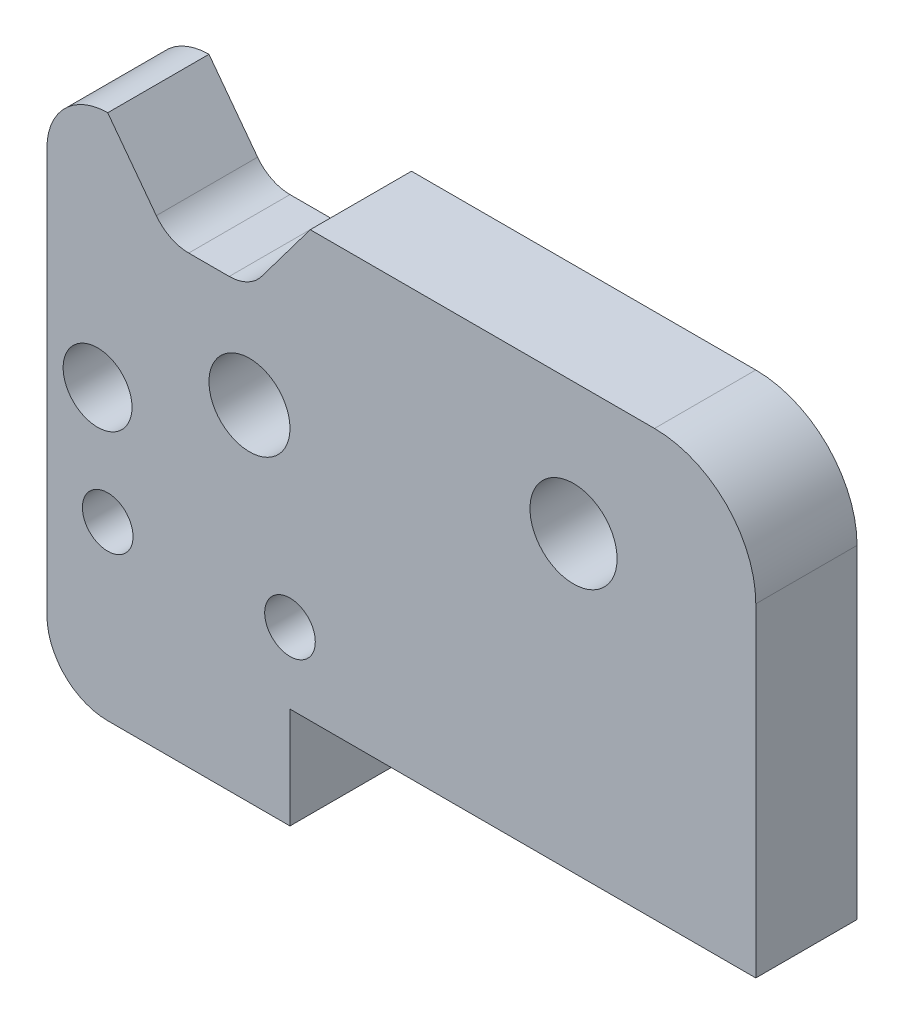
ISO-10303-21;
HEADER;
FILE_DESCRIPTION(('STEP AP214'),'2;1');
FILE_NAME('part.step','',(''),(''),'','','');
FILE_SCHEMA(('AUTOMOTIVE_DESIGN { 1 0 10303 214 1 1 1 1 }'));
ENDSEC;
DATA;
#1=APPLICATION_CONTEXT('core data for automotive mechanical design processes');
#2=APPLICATION_PROTOCOL_DEFINITION('international standard','automotive_design',2000,#1);
#3=PRODUCT_CONTEXT('',#1,'mechanical');
#4=PRODUCT('Part','Part','',(#3));
#5=PRODUCT_RELATED_PRODUCT_CATEGORY('part','',(#4));
#6=PRODUCT_DEFINITION_FORMATION('','',#4);
#7=PRODUCT_DEFINITION_CONTEXT('part definition',#1,'design');
#8=PRODUCT_DEFINITION('design','',#6,#7);
#9=PRODUCT_DEFINITION_SHAPE('','',#8);
#10=(LENGTH_UNIT() NAMED_UNIT(*) SI_UNIT(.MILLI.,.METRE.));
#11=(NAMED_UNIT(*) PLANE_ANGLE_UNIT() SI_UNIT($,.RADIAN.));
#12=(NAMED_UNIT(*) SI_UNIT($,.STERADIAN.) SOLID_ANGLE_UNIT());
#13=UNCERTAINTY_MEASURE_WITH_UNIT(LENGTH_MEASURE(1.E-05),#10,'distance_accuracy_value','');
#14=(GEOMETRIC_REPRESENTATION_CONTEXT(3) GLOBAL_UNCERTAINTY_ASSIGNED_CONTEXT((#13)) GLOBAL_UNIT_ASSIGNED_CONTEXT((#10,
#11,#12)) REPRESENTATION_CONTEXT('',''));
#15=CARTESIAN_POINT('',(0.,0.,0.));
#16=DIRECTION('',(0.,0.,1.));
#17=DIRECTION('',(1.,0.,0.));
#18=AXIS2_PLACEMENT_3D('',#15,#16,#17);
#19=CARTESIAN_POINT('',(15.,6.5,5.));
#20=DIRECTION('',(0.,-1.,0.));
#21=DIRECTION('',(1.,0.,0.));
#22=AXIS2_PLACEMENT_3D('',#19,#20,#21);
#23=PLANE('',#22);
#24=DIRECTION('',(-1.,0.,0.));
#25=VECTOR('',#24,1.);
#26=CARTESIAN_POINT('',(15.,6.5,0.));
#27=LINE('',#26,#25);
#28=CARTESIAN_POINT('',(10.,6.5,0.));
#29=VERTEX_POINT('',#28);
#30=CARTESIAN_POINT('',(-7.,6.5,0.));
#31=VERTEX_POINT('',#30);
#32=EDGE_CURVE('E161',#29,#31,#27,.T.);
#33=ORIENTED_EDGE('',*,*,#32,.T.);
#34=DIRECTION('',(0.,0.,1.));
#35=VECTOR('',#34,1.);
#36=CARTESIAN_POINT('',(-7.,6.5,-10.770329614269));
#37=LINE('',#36,#35);
#38=CARTESIAN_POINT('',(-7.,6.5,5.));
#39=VERTEX_POINT('',#38);
#40=EDGE_CURVE('E146',#31,#39,#37,.T.);
#41=ORIENTED_EDGE('',*,*,#40,.T.);
#42=DIRECTION('',(-1.,0.,0.));
#43=VECTOR('',#42,1.);
#44=CARTESIAN_POINT('',(15.,6.5,5.));
#45=LINE('',#44,#43);
#46=CARTESIAN_POINT('',(10.,6.5,5.));
#47=VERTEX_POINT('',#46);
#48=EDGE_CURVE('E158',#47,#39,#45,.T.);
#49=ORIENTED_EDGE('',*,*,#48,.F.);
#50=DIRECTION('',(0.,0.,-1.));
#51=VECTOR('',#50,1.);
#52=CARTESIAN_POINT('',(10.,6.5,5.));
#53=LINE('',#52,#51);
#54=EDGE_CURVE('E190',#47,#29,#53,.T.);
#55=ORIENTED_EDGE('',*,*,#54,.T.);
#56=EDGE_LOOP('',(#33,#41,#49,#55));
#57=FACE_BOUND('',#56,.T.);
#58=ADVANCED_FACE('F36',(#57),#23,.F.);
#59=CARTESIAN_POINT('',(-8.,-14.5,5.));
#60=DIRECTION('',(0.,1.,0.));
#61=DIRECTION('',(0.,0.,1.));
#62=AXIS2_PLACEMENT_3D('',#59,#60,#61);
#63=PLANE('',#62);
#64=CARTESIAN_POINT('',(12.,-14.5,2.5));
#65=DIRECTION('',(0.,-1.,0.));
#66=DIRECTION('',(0.,0.,-1.));
#67=AXIS2_PLACEMENT_3D('',#64,#65,#66);
#68=CIRCLE('',#67,1.25);
#69=CARTESIAN_POINT('',(12.,-14.5,1.25));
#70=VERTEX_POINT('',#69);
#71=EDGE_CURVE('E292',#70,#70,#68,.T.);
#72=ORIENTED_EDGE('',*,*,#71,.F.);
#73=EDGE_LOOP('',(#72));
#74=FACE_BOUND('',#73,.T.);
#75=CARTESIAN_POINT('',(-1.4,-14.5,2.5));
#76=DIRECTION('',(0.,-1.,0.));
#77=DIRECTION('',(0.,0.,-1.));
#78=AXIS2_PLACEMENT_3D('',#75,#76,#77);
#79=CIRCLE('',#78,1.25);
#80=CARTESIAN_POINT('',(-1.4,-14.5,1.25));
#81=VERTEX_POINT('',#80);
#82=EDGE_CURVE('E299',#81,#81,#79,.T.);
#83=ORIENTED_EDGE('',*,*,#82,.F.);
#84=EDGE_LOOP('',(#83));
#85=FACE_BOUND('',#84,.T.);
#86=DIRECTION('',(1.,0.,0.));
#87=VECTOR('',#86,1.);
#88=CARTESIAN_POINT('',(-8.,-14.5,0.));
#89=LINE('',#88,#87);
#90=CARTESIAN_POINT('',(-8.,-14.5,0.));
#91=VERTEX_POINT('',#90);
#92=CARTESIAN_POINT('',(15.,-14.5,0.));
#93=VERTEX_POINT('',#92);
#94=EDGE_CURVE('E175',#91,#93,#89,.T.);
#95=ORIENTED_EDGE('',*,*,#94,.T.);
#96=DIRECTION('',(0.,0.,-1.));
#97=VECTOR('',#96,1.);
#98=CARTESIAN_POINT('',(15.,-14.5,5.));
#99=LINE('',#98,#97);
#100=CARTESIAN_POINT('',(15.,-14.5,5.));
#101=VERTEX_POINT('',#100);
#102=EDGE_CURVE('E182',#101,#93,#99,.T.);
#103=ORIENTED_EDGE('',*,*,#102,.F.);
#104=DIRECTION('',(1.,0.,0.));
#105=VECTOR('',#104,1.);
#106=CARTESIAN_POINT('',(-8.,-14.5,5.));
#107=LINE('',#106,#105);
#108=CARTESIAN_POINT('',(-8.,-14.5,5.));
#109=VERTEX_POINT('',#108);
#110=EDGE_CURVE('E169',#109,#101,#107,.T.);
#111=ORIENTED_EDGE('',*,*,#110,.F.);
#112=DIRECTION('',(0.,0.,-1.));
#113=VECTOR('',#112,1.);
#114=CARTESIAN_POINT('',(-8.,-14.5,5.));
#115=LINE('',#114,#113);
#116=EDGE_CURVE('E187',#109,#91,#115,.T.);
#117=ORIENTED_EDGE('',*,*,#116,.T.);
#118=EDGE_LOOP('',(#95,#103,#111,#117));
#119=FACE_BOUND('',#118,.T.);
#120=ADVANCED_FACE('F319',(#74,#85,#119),#63,.F.);
#121=CARTESIAN_POINT('',(15.,-14.5,5.));
#122=DIRECTION('',(-1.,0.,0.));
#123=DIRECTION('',(0.,0.,1.));
#124=AXIS2_PLACEMENT_3D('',#121,#122,#123);
#125=PLANE('',#124);
#126=DIRECTION('',(0.,1.,0.));
#127=VECTOR('',#126,1.);
#128=CARTESIAN_POINT('',(15.,-14.5,0.));
#129=LINE('',#128,#127);
#130=CARTESIAN_POINT('',(15.,1.49999999999999,0.));
#131=VERTEX_POINT('',#130);
#132=EDGE_CURVE('E170',#93,#131,#129,.T.);
#133=ORIENTED_EDGE('',*,*,#132,.T.);
#134=DIRECTION('',(0.,0.,-1.));
#135=VECTOR('',#134,1.);
#136=CARTESIAN_POINT('',(15.,1.5,5.));
#137=LINE('',#136,#135);
#138=CARTESIAN_POINT('',(15.,1.49999999999999,5.));
#139=VERTEX_POINT('',#138);
#140=EDGE_CURVE('E579',#131,#139,#137,.F.);
#141=ORIENTED_EDGE('',*,*,#140,.T.);
#142=DIRECTION('',(0.,1.,0.));
#143=VECTOR('',#142,1.);
#144=CARTESIAN_POINT('',(15.,-14.5,5.));
#145=LINE('',#144,#143);
#146=EDGE_CURVE('E172',#101,#139,#145,.T.);
#147=ORIENTED_EDGE('',*,*,#146,.F.);
#148=ORIENTED_EDGE('',*,*,#102,.T.);
#149=EDGE_LOOP('',(#133,#141,#147,#148));
#150=FACE_BOUND('',#149,.T.);
#151=ADVANCED_FACE('F310',(#150),#125,.F.);
#152=CARTESIAN_POINT('',(-8.,6.5,5.));
#153=DIRECTION('',(0.,0.,1.));
#154=DIRECTION('',(1.,0.,0.));
#155=AXIS2_PLACEMENT_3D('',#152,#153,#154);
#156=PLANE('',#155);
#157=CARTESIAN_POINT('',(-8.00000000000001,-11.,5.));
#158=DIRECTION('',(0.,0.,1.));
#159=DIRECTION('',(1.,0.,0.));
#160=AXIS2_PLACEMENT_3D('',#157,#158,#159);
#161=CIRCLE('',#160,1.25);
#162=CARTESIAN_POINT('',(-6.75000000000001,-11.,5.));
#163=VERTEX_POINT('',#162);
#164=EDGE_CURVE('E545',#163,#163,#161,.T.);
#165=ORIENTED_EDGE('',*,*,#164,.F.);
#166=EDGE_LOOP('',(#165));
#167=FACE_BOUND('',#166,.T.);
#168=CARTESIAN_POINT('',(-17.,-11.,5.));
#169=DIRECTION('',(0.,0.,1.));
#170=DIRECTION('',(1.,0.,0.));
#171=AXIS2_PLACEMENT_3D('',#168,#169,#170);
#172=CIRCLE('',#171,1.25);
#173=CARTESIAN_POINT('',(-15.75,-11.,5.));
#174=VERTEX_POINT('',#173);
#175=EDGE_CURVE('E247',#174,#174,#172,.T.);
#176=ORIENTED_EDGE('',*,*,#175,.F.);
#177=EDGE_LOOP('',(#176));
#178=FACE_BOUND('',#177,.T.);
#179=DIRECTION('',(0.6,-0.8,0.));
#180=VECTOR('',#179,1.);
#181=CARTESIAN_POINT('',(-14.,2.5,5.));
#182=LINE('',#181,#180);
#183=CARTESIAN_POINT('',(-17.,6.5,5.));
#184=VERTEX_POINT('',#183);
#185=CARTESIAN_POINT('',(-14.6,3.3,5.));
#186=VERTEX_POINT('',#185);
#187=EDGE_CURVE('E151',#184,#186,#182,.T.);
#188=ORIENTED_EDGE('',*,*,#187,.F.);
#189=CARTESIAN_POINT('',(-17.,3.5,5.));
#190=DIRECTION('',(0.,0.,1.));
#191=DIRECTION('',(1.,0.,0.));
#192=AXIS2_PLACEMENT_3D('',#189,#190,#191);
#193=CIRCLE('',#192,3.);
#194=CARTESIAN_POINT('',(-20.,3.5,5.));
#195=VERTEX_POINT('',#194);
#196=EDGE_CURVE('E216',#184,#195,#193,.T.);
#197=ORIENTED_EDGE('',*,*,#196,.T.);
#198=DIRECTION('',(0.,1.,0.));
#199=VECTOR('',#198,1.);
#200=CARTESIAN_POINT('',(-20.,6.5,5.));
#201=LINE('',#200,#199);
#202=CARTESIAN_POINT('',(-20.,-16.5,5.));
#203=VERTEX_POINT('',#202);
#204=EDGE_CURVE('E560',#203,#195,#201,.T.);
#205=ORIENTED_EDGE('',*,*,#204,.F.);
#206=CARTESIAN_POINT('',(-17.,-16.5,5.));
#207=DIRECTION('',(0.,0.,1.));
#208=DIRECTION('',(1.,0.,0.));
#209=AXIS2_PLACEMENT_3D('',#206,#207,#208);
#210=CIRCLE('',#209,3.);
#211=CARTESIAN_POINT('',(-17.,-19.5,5.));
#212=VERTEX_POINT('',#211);
#213=EDGE_CURVE('E214',#203,#212,#210,.T.);
#214=ORIENTED_EDGE('',*,*,#213,.T.);
#215=DIRECTION('',(-1.,0.,0.));
#216=VECTOR('',#215,1.);
#217=CARTESIAN_POINT('',(-8.,-19.5,5.));
#218=LINE('',#217,#216);
#219=CARTESIAN_POINT('',(-8.,-19.5,5.));
#220=VERTEX_POINT('',#219);
#221=EDGE_CURVE('E277',#220,#212,#218,.T.);
#222=ORIENTED_EDGE('',*,*,#221,.F.);
#223=DIRECTION('',(0.,-1.,0.));
#224=VECTOR('',#223,1.);
#225=CARTESIAN_POINT('',(-8.,6.5,5.));
#226=LINE('',#225,#224);
#227=EDGE_CURVE('E287',#109,#220,#226,.T.);
#228=ORIENTED_EDGE('',*,*,#227,.F.);
#229=ORIENTED_EDGE('',*,*,#110,.T.);
#230=ORIENTED_EDGE('',*,*,#146,.T.);
#231=CARTESIAN_POINT('',(10.,1.5,5.));
#232=DIRECTION('',(0.,0.,1.));
#233=DIRECTION('',(1.,0.,0.));
#234=AXIS2_PLACEMENT_3D('',#231,#232,#233);
#235=CIRCLE('',#234,5.);
#236=EDGE_CURVE('E168',#139,#47,#235,.T.);
#237=ORIENTED_EDGE('',*,*,#236,.T.);
#238=ORIENTED_EDGE('',*,*,#48,.T.);
#239=DIRECTION('',(0.600000000000001,0.799999999999999,0.));
#240=VECTOR('',#239,1.);
#241=CARTESIAN_POINT('',(-10.,2.5,5.));
#242=LINE('',#241,#240);
#243=CARTESIAN_POINT('',(-9.40000000000001,3.3,5.));
#244=VERTEX_POINT('',#243);
#245=EDGE_CURVE('E142',#244,#39,#242,.T.);
#246=ORIENTED_EDGE('',*,*,#245,.F.);
#247=CARTESIAN_POINT('',(-11.,4.5,5.));
#248=DIRECTION('',(0.,0.,1.));
#249=DIRECTION('',(1.,0.,0.));
#250=AXIS2_PLACEMENT_3D('',#247,#248,#249);
#251=CIRCLE('',#250,2.);
#252=CARTESIAN_POINT('',(-11.,2.5,5.));
#253=VERTEX_POINT('',#252);
#254=EDGE_CURVE('E228',#244,#253,#251,.F.);
#255=ORIENTED_EDGE('',*,*,#254,.T.);
#256=DIRECTION('',(1.,0.,0.));
#257=VECTOR('',#256,1.);
#258=CARTESIAN_POINT('',(-14.,2.5,5.));
#259=LINE('',#258,#257);
#260=CARTESIAN_POINT('',(-13.,2.5,5.));
#261=VERTEX_POINT('',#260);
#262=EDGE_CURVE('E152',#261,#253,#259,.T.);
#263=ORIENTED_EDGE('',*,*,#262,.F.);
#264=CARTESIAN_POINT('',(-13.,4.5,5.));
#265=DIRECTION('',(0.,0.,1.));
#266=DIRECTION('',(1.,0.,0.));
#267=AXIS2_PLACEMENT_3D('',#264,#265,#266);
#268=CIRCLE('',#267,2.);
#269=EDGE_CURVE('E44',#261,#186,#268,.F.);
#270=ORIENTED_EDGE('',*,*,#269,.T.);
#271=EDGE_LOOP('',(#188,#197,#205,#214,#222,#228,#229,#230,#237,#238,#246,#255,#263,#270));
#272=FACE_BOUND('',#271,.T.);
#273=CARTESIAN_POINT('',(-10.,-2.5,5.));
#274=DIRECTION('',(0.,0.,1.));
#275=DIRECTION('',(1.,0.,0.));
#276=AXIS2_PLACEMENT_3D('',#273,#274,#275);
#277=CIRCLE('',#276,2.);
#278=CARTESIAN_POINT('',(-8.,-2.5,5.));
#279=VERTEX_POINT('',#278);
#280=EDGE_CURVE('E261',#279,#279,#277,.T.);
#281=ORIENTED_EDGE('',*,*,#280,.F.);
#282=EDGE_LOOP('',(#281));
#283=FACE_BOUND('',#282,.T.);
#284=CARTESIAN_POINT('',(-17.5,-5.5,5.));
#285=DIRECTION('',(0.,0.,1.));
#286=DIRECTION('',(1.,0.,0.));
#287=AXIS2_PLACEMENT_3D('',#284,#285,#286);
#288=CIRCLE('',#287,1.7);
#289=CARTESIAN_POINT('',(-15.8,-5.5,5.));
#290=VERTEX_POINT('',#289);
#291=EDGE_CURVE('E265',#290,#290,#288,.T.);
#292=ORIENTED_EDGE('',*,*,#291,.F.);
#293=EDGE_LOOP('',(#292));
#294=FACE_BOUND('',#293,.T.);
#295=CARTESIAN_POINT('',(6.,0.,5.));
#296=DIRECTION('',(0.,0.,1.));
#297=DIRECTION('',(1.,0.,0.));
#298=AXIS2_PLACEMENT_3D('',#295,#296,#297);
#299=CIRCLE('',#298,2.15);
#300=CARTESIAN_POINT('',(8.15,0.,5.));
#301=VERTEX_POINT('',#300);
#302=EDGE_CURVE('E179',#301,#301,#299,.T.);
#303=ORIENTED_EDGE('',*,*,#302,.F.);
#304=EDGE_LOOP('',(#303));
#305=FACE_BOUND('',#304,.T.);
#306=ADVANCED_FACE('F164',(#167,#178,#272,#283,#294,#305),#156,.T.);
#307=CARTESIAN_POINT('',(-8.,6.5,0.));
#308=DIRECTION('',(0.,0.,1.));
#309=DIRECTION('',(1.,0.,0.));
#310=AXIS2_PLACEMENT_3D('',#307,#308,#309);
#311=PLANE('',#310);
#312=CARTESIAN_POINT('',(-8.00000000000001,-11.,0.));
#313=DIRECTION('',(0.,0.,-1.));
#314=DIRECTION('',(-1.,0.,0.));
#315=AXIS2_PLACEMENT_3D('',#312,#313,#314);
#316=CIRCLE('',#315,1.25);
#317=CARTESIAN_POINT('',(-9.25000000000001,-11.,0.));
#318=VERTEX_POINT('',#317);
#319=EDGE_CURVE('E548',#318,#318,#316,.T.);
#320=ORIENTED_EDGE('',*,*,#319,.F.);
#321=EDGE_LOOP('',(#320));
#322=FACE_BOUND('',#321,.T.);
#323=CARTESIAN_POINT('',(-17.,-11.,0.));
#324=DIRECTION('',(0.,0.,-1.));
#325=DIRECTION('',(-1.,0.,0.));
#326=AXIS2_PLACEMENT_3D('',#323,#324,#325);
#327=CIRCLE('',#326,1.25);
#328=CARTESIAN_POINT('',(-18.25,-11.,0.));
#329=VERTEX_POINT('',#328);
#330=EDGE_CURVE('E250',#329,#329,#327,.T.);
#331=ORIENTED_EDGE('',*,*,#330,.F.);
#332=EDGE_LOOP('',(#331));
#333=FACE_BOUND('',#332,.T.);
#334=CARTESIAN_POINT('',(-17.5,-5.5,0.));
#335=DIRECTION('',(0.,0.,1.));
#336=DIRECTION('',(1.,0.,0.));
#337=AXIS2_PLACEMENT_3D('',#334,#335,#336);
#338=CIRCLE('',#337,1.7);
#339=CARTESIAN_POINT('',(-15.8,-5.5,0.));
#340=VERTEX_POINT('',#339);
#341=EDGE_CURVE('E270',#340,#340,#338,.F.);
#342=ORIENTED_EDGE('',*,*,#341,.F.);
#343=EDGE_LOOP('',(#342));
#344=FACE_BOUND('',#343,.T.);
#345=CARTESIAN_POINT('',(4.9,-6.5,0.));
#346=DIRECTION('',(0.,0.,-1.));
#347=DIRECTION('',(-1.,0.,0.));
#348=AXIS2_PLACEMENT_3D('',#345,#346,#347);
#349=CIRCLE('',#348,2.05);
#350=CARTESIAN_POINT('',(2.85,-6.5,0.));
#351=VERTEX_POINT('',#350);
#352=EDGE_CURVE('E293',#351,#351,#349,.T.);
#353=ORIENTED_EDGE('',*,*,#352,.F.);
#354=EDGE_LOOP('',(#353));
#355=FACE_BOUND('',#354,.T.);
#356=CARTESIAN_POINT('',(-17.,3.5,0.));
#357=DIRECTION('',(0.,0.,1.));
#358=DIRECTION('',(1.,0.,0.));
#359=AXIS2_PLACEMENT_3D('',#356,#357,#358);
#360=CIRCLE('',#359,3.);
#361=CARTESIAN_POINT('',(-20.,3.5,0.));
#362=VERTEX_POINT('',#361);
#363=CARTESIAN_POINT('',(-17.,6.5,0.));
#364=VERTEX_POINT('',#363);
#365=EDGE_CURVE('E209',#362,#364,#360,.F.);
#366=ORIENTED_EDGE('',*,*,#365,.T.);
#367=DIRECTION('',(-0.6,0.8,0.));
#368=VECTOR('',#367,1.);
#369=CARTESIAN_POINT('',(-14.,2.5,0.));
#370=LINE('',#369,#368);
#371=CARTESIAN_POINT('',(-14.6,3.3,0.));
#372=VERTEX_POINT('',#371);
#373=EDGE_CURVE('E162',#372,#364,#370,.T.);
#374=ORIENTED_EDGE('',*,*,#373,.F.);
#375=CARTESIAN_POINT('',(-13.,4.5,0.));
#376=DIRECTION('',(0.,0.,1.));
#377=DIRECTION('',(1.,0.,0.));
#378=AXIS2_PLACEMENT_3D('',#375,#376,#377);
#379=CIRCLE('',#378,2.);
#380=CARTESIAN_POINT('',(-13.,2.5,0.));
#381=VERTEX_POINT('',#380);
#382=EDGE_CURVE('E11',#372,#381,#379,.T.);
#383=ORIENTED_EDGE('',*,*,#382,.T.);
#384=DIRECTION('',(-1.,0.,0.));
#385=VECTOR('',#384,1.);
#386=CARTESIAN_POINT('',(-14.,2.5,0.));
#387=LINE('',#386,#385);
#388=CARTESIAN_POINT('',(-11.,2.5,0.));
#389=VERTEX_POINT('',#388);
#390=EDGE_CURVE('E237',#389,#381,#387,.T.);
#391=ORIENTED_EDGE('',*,*,#390,.F.);
#392=CARTESIAN_POINT('',(-11.,4.5,0.));
#393=DIRECTION('',(0.,0.,1.));
#394=DIRECTION('',(1.,0.,0.));
#395=AXIS2_PLACEMENT_3D('',#392,#393,#394);
#396=CIRCLE('',#395,2.);
#397=CARTESIAN_POINT('',(-9.40000000000001,3.3,0.));
#398=VERTEX_POINT('',#397);
#399=EDGE_CURVE('E230',#389,#398,#396,.T.);
#400=ORIENTED_EDGE('',*,*,#399,.T.);
#401=DIRECTION('',(-0.600000000000001,-0.799999999999999,0.));
#402=VECTOR('',#401,1.);
#403=CARTESIAN_POINT('',(-10.,2.5,0.));
#404=LINE('',#403,#402);
#405=EDGE_CURVE('E235',#31,#398,#404,.T.);
#406=ORIENTED_EDGE('',*,*,#405,.F.);
#407=ORIENTED_EDGE('',*,*,#32,.F.);
#408=CARTESIAN_POINT('',(10.,1.5,0.));
#409=DIRECTION('',(0.,0.,1.));
#410=DIRECTION('',(1.,0.,0.));
#411=AXIS2_PLACEMENT_3D('',#408,#409,#410);
#412=CIRCLE('',#411,5.);
#413=EDGE_CURVE('E580',#29,#131,#412,.F.);
#414=ORIENTED_EDGE('',*,*,#413,.T.);
#415=ORIENTED_EDGE('',*,*,#132,.F.);
#416=ORIENTED_EDGE('',*,*,#94,.F.);
#417=DIRECTION('',(0.,-1.,0.));
#418=VECTOR('',#417,1.);
#419=CARTESIAN_POINT('',(-8.,6.5,0.));
#420=LINE('',#419,#418);
#421=CARTESIAN_POINT('',(-8.,-19.5,0.));
#422=VERTEX_POINT('',#421);
#423=EDGE_CURVE('E273',#91,#422,#420,.T.);
#424=ORIENTED_EDGE('',*,*,#423,.T.);
#425=DIRECTION('',(-1.,0.,0.));
#426=VECTOR('',#425,1.);
#427=CARTESIAN_POINT('',(-8.,-19.5,0.));
#428=LINE('',#427,#426);
#429=CARTESIAN_POINT('',(-17.,-19.5,0.));
#430=VERTEX_POINT('',#429);
#431=EDGE_CURVE('E278',#422,#430,#428,.T.);
#432=ORIENTED_EDGE('',*,*,#431,.T.);
#433=CARTESIAN_POINT('',(-17.,-16.5,0.));
#434=DIRECTION('',(0.,0.,1.));
#435=DIRECTION('',(1.,0.,0.));
#436=AXIS2_PLACEMENT_3D('',#433,#434,#435);
#437=CIRCLE('',#436,3.);
#438=CARTESIAN_POINT('',(-20.,-16.5,0.));
#439=VERTEX_POINT('',#438);
#440=EDGE_CURVE('E207',#430,#439,#437,.F.);
#441=ORIENTED_EDGE('',*,*,#440,.T.);
#442=DIRECTION('',(0.,1.,0.));
#443=VECTOR('',#442,1.);
#444=CARTESIAN_POINT('',(-20.,6.5,0.));
#445=LINE('',#444,#443);
#446=EDGE_CURVE('E274',#439,#362,#445,.T.);
#447=ORIENTED_EDGE('',*,*,#446,.T.);
#448=EDGE_LOOP('',(#366,#374,#383,#391,#400,#406,#407,#414,#415,#416,#424,#432,#441,#447));
#449=FACE_BOUND('',#448,.T.);
#450=ADVANCED_FACE('F234',(#322,#333,#344,#355,#449),#311,.F.);
#451=CARTESIAN_POINT('',(6.,0.,0.5));
#452=DIRECTION('',(0.,0.,1.));
#453=DIRECTION('',(1.,0.,0.));
#454=AXIS2_PLACEMENT_3D('',#451,#452,#453);
#455=CYLINDRICAL_SURFACE('',#454,2.15);
#456=CARTESIAN_POINT('',(6.,0.,0.5));
#457=DIRECTION('',(0.,0.,1.));
#458=DIRECTION('',(1.,0.,0.));
#459=AXIS2_PLACEMENT_3D('',#456,#457,#458);
#460=CIRCLE('',#459,2.15);
#461=CARTESIAN_POINT('',(8.15,0.,0.5));
#462=VERTEX_POINT('',#461);
#463=EDGE_CURVE('E183',#462,#462,#460,.T.);
#464=ORIENTED_EDGE('',*,*,#463,.F.);
#465=EDGE_LOOP('',(#464));
#466=FACE_BOUND('',#465,.T.);
#467=ORIENTED_EDGE('',*,*,#302,.T.);
#468=EDGE_LOOP('',(#467));
#469=FACE_BOUND('',#468,.T.);
#470=ADVANCED_FACE('F307',(#466,#469),#455,.F.);
#471=CARTESIAN_POINT('',(6.,0.,0.5));
#472=DIRECTION('',(0.,0.,1.));
#473=DIRECTION('',(1.,0.,0.));
#474=AXIS2_PLACEMENT_3D('',#471,#472,#473);
#475=PLANE('',#474);
#476=ORIENTED_EDGE('',*,*,#463,.T.);
#477=EDGE_LOOP('',(#476));
#478=FACE_BOUND('',#477,.T.);
#479=ADVANCED_FACE('F408',(#478),#475,.T.);
#480=CARTESIAN_POINT('',(-1.4,-6.5,2.5));
#481=DIRECTION('',(0.,-1.,0.));
#482=DIRECTION('',(0.,0.,-1.));
#483=AXIS2_PLACEMENT_3D('',#480,#481,#482);
#484=CYLINDRICAL_SURFACE('',#483,1.25);
#485=CARTESIAN_POINT('',(-1.4,-6.5,2.5));
#486=DIRECTION('',(0.,-1.,0.));
#487=DIRECTION('',(0.,0.,-1.));
#488=AXIS2_PLACEMENT_3D('',#485,#486,#487);
#489=CIRCLE('',#488,1.25);
#490=CARTESIAN_POINT('',(-1.4,-6.5,1.25));
#491=VERTEX_POINT('',#490);
#492=EDGE_CURVE('E240',#491,#491,#489,.T.);
#493=ORIENTED_EDGE('',*,*,#492,.F.);
#494=EDGE_LOOP('',(#493));
#495=FACE_BOUND('',#494,.T.);
#496=ORIENTED_EDGE('',*,*,#82,.T.);
#497=EDGE_LOOP('',(#496));
#498=FACE_BOUND('',#497,.T.);
#499=ADVANCED_FACE('F404',(#495,#498),#484,.F.);
#500=CARTESIAN_POINT('',(12.,-6.5,2.5));
#501=DIRECTION('',(0.,-1.,0.));
#502=DIRECTION('',(0.,0.,-1.));
#503=AXIS2_PLACEMENT_3D('',#500,#501,#502);
#504=CYLINDRICAL_SURFACE('',#503,1.25);
#505=CARTESIAN_POINT('',(12.,-6.5,2.5));
#506=DIRECTION('',(0.,-1.,0.));
#507=DIRECTION('',(0.,0.,-1.));
#508=AXIS2_PLACEMENT_3D('',#505,#506,#507);
#509=CIRCLE('',#508,1.25);
#510=CARTESIAN_POINT('',(12.,-6.5,1.25));
#511=VERTEX_POINT('',#510);
#512=EDGE_CURVE('E258',#511,#511,#509,.T.);
#513=ORIENTED_EDGE('',*,*,#512,.F.);
#514=EDGE_LOOP('',(#513));
#515=FACE_BOUND('',#514,.T.);
#516=ORIENTED_EDGE('',*,*,#71,.T.);
#517=EDGE_LOOP('',(#516));
#518=FACE_BOUND('',#517,.T.);
#519=ADVANCED_FACE('F337',(#515,#518),#504,.F.);
#520=CARTESIAN_POINT('',(10.,1.5,5.));
#521=DIRECTION('',(0.,0.,-1.));
#522=DIRECTION('',(-1.,0.,0.));
#523=AXIS2_PLACEMENT_3D('',#520,#521,#522);
#524=CYLINDRICAL_SURFACE('',#523,5.);
#525=ORIENTED_EDGE('',*,*,#236,.F.);
#526=ORIENTED_EDGE('',*,*,#140,.F.);
#527=ORIENTED_EDGE('',*,*,#413,.F.);
#528=ORIENTED_EDGE('',*,*,#54,.F.);
#529=EDGE_LOOP('',(#525,#526,#527,#528));
#530=FACE_BOUND('',#529,.T.);
#531=ADVANCED_FACE('F333',(#530),#524,.T.);
#532=CARTESIAN_POINT('',(4.9,-6.5,4.5));
#533=DIRECTION('',(0.,0.,-1.));
#534=DIRECTION('',(-1.,0.,0.));
#535=AXIS2_PLACEMENT_3D('',#532,#533,#534);
#536=CYLINDRICAL_SURFACE('',#535,2.05);
#537=CARTESIAN_POINT('',(4.9,-6.5,4.5));
#538=DIRECTION('',(0.,0.,-1.));
#539=DIRECTION('',(-1.,0.,0.));
#540=AXIS2_PLACEMENT_3D('',#537,#538,#539);
#541=CIRCLE('',#540,2.05);
#542=CARTESIAN_POINT('',(2.85,-6.5,4.5));
#543=VERTEX_POINT('',#542);
#544=EDGE_CURVE('E289',#543,#543,#541,.T.);
#545=ORIENTED_EDGE('',*,*,#544,.F.);
#546=EDGE_LOOP('',(#545));
#547=FACE_BOUND('',#546,.T.);
#548=ORIENTED_EDGE('',*,*,#352,.T.);
#549=EDGE_LOOP('',(#548));
#550=FACE_BOUND('',#549,.T.);
#551=ADVANCED_FACE('F336',(#547,#550),#536,.F.);
#552=CARTESIAN_POINT('',(4.9,-6.5,4.5));
#553=DIRECTION('',(0.,0.,-1.));
#554=DIRECTION('',(-1.,0.,0.));
#555=AXIS2_PLACEMENT_3D('',#552,#553,#554);
#556=PLANE('',#555);
#557=ORIENTED_EDGE('',*,*,#544,.T.);
#558=EDGE_LOOP('',(#557));
#559=FACE_BOUND('',#558,.T.);
#560=ADVANCED_FACE('F388',(#559),#556,.T.);
#561=CARTESIAN_POINT('',(-8.,6.5,33.6356421265527));
#562=DIRECTION('',(1.,0.,0.));
#563=DIRECTION('',(0.,1.,0.));
#564=AXIS2_PLACEMENT_3D('',#561,#562,#563);
#565=PLANE('',#564);
#566=ORIENTED_EDGE('',*,*,#116,.F.);
#567=ORIENTED_EDGE('',*,*,#227,.T.);
#568=DIRECTION('',(0.,0.,-1.));
#569=VECTOR('',#568,1.);
#570=CARTESIAN_POINT('',(-8.,-19.5,33.6356421265527));
#571=LINE('',#570,#569);
#572=EDGE_CURVE('E296',#220,#422,#571,.T.);
#573=ORIENTED_EDGE('',*,*,#572,.T.);
#574=ORIENTED_EDGE('',*,*,#423,.F.);
#575=EDGE_LOOP('',(#566,#567,#573,#574));
#576=FACE_BOUND('',#575,.T.);
#577=ADVANCED_FACE('F384',(#576),#565,.T.);
#578=CARTESIAN_POINT('',(-8.,-19.5,33.6356421265527));
#579=DIRECTION('',(0.,-1.,0.));
#580=DIRECTION('',(0.,0.,-1.));
#581=AXIS2_PLACEMENT_3D('',#578,#579,#580);
#582=PLANE('',#581);
#583=ORIENTED_EDGE('',*,*,#221,.T.);
#584=DIRECTION('',(0.,0.,-1.));
#585=VECTOR('',#584,1.);
#586=CARTESIAN_POINT('',(-17.,-19.5,33.6356421265527));
#587=LINE('',#586,#585);
#588=EDGE_CURVE('E218',#212,#430,#587,.T.);
#589=ORIENTED_EDGE('',*,*,#588,.T.);
#590=ORIENTED_EDGE('',*,*,#431,.F.);
#591=ORIENTED_EDGE('',*,*,#572,.F.);
#592=EDGE_LOOP('',(#583,#589,#590,#591));
#593=FACE_BOUND('',#592,.T.);
#594=ADVANCED_FACE('F387',(#593),#582,.T.);
#595=CARTESIAN_POINT('',(-20.,6.5,33.6356421265527));
#596=DIRECTION('',(-1.,0.,0.));
#597=DIRECTION('',(0.,-1.,0.));
#598=AXIS2_PLACEMENT_3D('',#595,#596,#597);
#599=PLANE('',#598);
#600=ORIENTED_EDGE('',*,*,#204,.T.);
#601=DIRECTION('',(0.,0.,-1.));
#602=VECTOR('',#601,1.);
#603=CARTESIAN_POINT('',(-20.,3.5,0.));
#604=LINE('',#603,#602);
#605=EDGE_CURVE('E204',#195,#362,#604,.T.);
#606=ORIENTED_EDGE('',*,*,#605,.T.);
#607=ORIENTED_EDGE('',*,*,#446,.F.);
#608=DIRECTION('',(0.,0.,-1.));
#609=VECTOR('',#608,1.);
#610=CARTESIAN_POINT('',(-20.,-16.5,33.6356421265527));
#611=LINE('',#610,#609);
#612=EDGE_CURVE('E202',#439,#203,#611,.F.);
#613=ORIENTED_EDGE('',*,*,#612,.T.);
#614=EDGE_LOOP('',(#600,#606,#607,#613));
#615=FACE_BOUND('',#614,.T.);
#616=ADVANCED_FACE('F382',(#615),#599,.T.);
#617=CARTESIAN_POINT('',(-17.5,-5.5,-4.80832611206852));
#618=DIRECTION('',(0.,0.,1.));
#619=DIRECTION('',(1.,0.,0.));
#620=AXIS2_PLACEMENT_3D('',#617,#618,#619);
#621=CYLINDRICAL_SURFACE('',#620,1.7);
#622=ORIENTED_EDGE('',*,*,#341,.T.);
#623=EDGE_LOOP('',(#622));
#624=FACE_BOUND('',#623,.T.);
#625=ORIENTED_EDGE('',*,*,#291,.T.);
#626=EDGE_LOOP('',(#625));
#627=FACE_BOUND('',#626,.T.);
#628=ADVANCED_FACE('F378',(#624,#627),#621,.F.);
#629=CARTESIAN_POINT('',(-10.,-2.5,1.));
#630=DIRECTION('',(0.,0.,1.));
#631=DIRECTION('',(1.,0.,0.));
#632=AXIS2_PLACEMENT_3D('',#629,#630,#631);
#633=CYLINDRICAL_SURFACE('',#632,2.);
#634=CARTESIAN_POINT('',(-10.,-2.5,1.));
#635=DIRECTION('',(0.,0.,1.));
#636=DIRECTION('',(1.,0.,0.));
#637=AXIS2_PLACEMENT_3D('',#634,#635,#636);
#638=CIRCLE('',#637,2.);
#639=CARTESIAN_POINT('',(-8.,-2.5,1.));
#640=VERTEX_POINT('',#639);
#641=EDGE_CURVE('E262',#640,#640,#638,.T.);
#642=ORIENTED_EDGE('',*,*,#641,.F.);
#643=EDGE_LOOP('',(#642));
#644=FACE_BOUND('',#643,.T.);
#645=ORIENTED_EDGE('',*,*,#280,.T.);
#646=EDGE_LOOP('',(#645));
#647=FACE_BOUND('',#646,.T.);
#648=ADVANCED_FACE('F374',(#644,#647),#633,.F.);
#649=CARTESIAN_POINT('',(-10.,-2.5,1.));
#650=DIRECTION('',(0.,0.,1.));
#651=DIRECTION('',(1.,0.,0.));
#652=AXIS2_PLACEMENT_3D('',#649,#650,#651);
#653=PLANE('',#652);
#654=ORIENTED_EDGE('',*,*,#641,.T.);
#655=EDGE_LOOP('',(#654));
#656=FACE_BOUND('',#655,.T.);
#657=ADVANCED_FACE('F370',(#656),#653,.T.);
#658=CARTESIAN_POINT('',(12.,-6.5,2.5));
#659=DIRECTION('',(0.,-1.,0.));
#660=DIRECTION('',(0.,0.,-1.));
#661=AXIS2_PLACEMENT_3D('',#658,#659,#660);
#662=CONICAL_SURFACE('',#661,1.25,1.02974425867665);
#663=CARTESIAN_POINT('',(12.,-5.74892422621555,2.5));
#664=VERTEX_POINT('',#663);
#665=VERTEX_LOOP('',#664);
#666=FACE_BOUND('',#665,.T.);
#667=ORIENTED_EDGE('',*,*,#512,.T.);
#668=EDGE_LOOP('',(#667));
#669=FACE_BOUND('',#668,.T.);
#670=ADVANCED_FACE('F366',(#666,#669),#662,.F.);
#671=CARTESIAN_POINT('',(-1.4,-6.5,2.5));
#672=DIRECTION('',(0.,-1.,0.));
#673=DIRECTION('',(0.,0.,-1.));
#674=AXIS2_PLACEMENT_3D('',#671,#672,#673);
#675=CONICAL_SURFACE('',#674,1.25,1.02974425867665);
#676=CARTESIAN_POINT('',(-1.4,-5.74892422621555,2.5));
#677=VERTEX_POINT('',#676);
#678=VERTEX_LOOP('',#677);
#679=FACE_BOUND('',#678,.T.);
#680=ORIENTED_EDGE('',*,*,#492,.T.);
#681=EDGE_LOOP('',(#680));
#682=FACE_BOUND('',#681,.T.);
#683=ADVANCED_FACE('F343',(#679,#682),#675,.F.);
#684=CARTESIAN_POINT('',(-17.,3.5,33.6356421265527));
#685=DIRECTION('',(0.,0.,1.));
#686=DIRECTION('',(1.,0.,0.));
#687=AXIS2_PLACEMENT_3D('',#684,#685,#686);
#688=CYLINDRICAL_SURFACE('',#687,3.);
#689=ORIENTED_EDGE('',*,*,#196,.F.);
#690=DIRECTION('',(0.,0.,-1.));
#691=VECTOR('',#690,1.);
#692=CARTESIAN_POINT('',(-17.,6.5,5.));
#693=LINE('',#692,#691);
#694=EDGE_CURVE('E212',#364,#184,#693,.F.);
#695=ORIENTED_EDGE('',*,*,#694,.F.);
#696=ORIENTED_EDGE('',*,*,#365,.F.);
#697=ORIENTED_EDGE('',*,*,#605,.F.);
#698=EDGE_LOOP('',(#689,#695,#696,#697));
#699=FACE_BOUND('',#698,.T.);
#700=ADVANCED_FACE('F339',(#699),#688,.T.);
#701=CARTESIAN_POINT('',(-17.,-16.5,33.6356421265527));
#702=DIRECTION('',(0.,0.,-1.));
#703=DIRECTION('',(-1.,0.,0.));
#704=AXIS2_PLACEMENT_3D('',#701,#702,#703);
#705=CYLINDRICAL_SURFACE('',#704,3.);
#706=ORIENTED_EDGE('',*,*,#213,.F.);
#707=ORIENTED_EDGE('',*,*,#612,.F.);
#708=ORIENTED_EDGE('',*,*,#440,.F.);
#709=ORIENTED_EDGE('',*,*,#588,.F.);
#710=EDGE_LOOP('',(#706,#707,#708,#709));
#711=FACE_BOUND('',#710,.T.);
#712=ADVANCED_FACE('F342',(#711),#705,.T.);
#713=CARTESIAN_POINT('',(-14.,2.5,-10.770329614269));
#714=DIRECTION('',(0.,-1.,0.));
#715=DIRECTION('',(0.,0.,-1.));
#716=AXIS2_PLACEMENT_3D('',#713,#714,#715);
#717=PLANE('',#716);
#718=ORIENTED_EDGE('',*,*,#262,.T.);
#719=DIRECTION('',(0.,0.,1.));
#720=VECTOR('',#719,1.);
#721=CARTESIAN_POINT('',(-11.,2.5,0.));
#722=LINE('',#721,#720);
#723=EDGE_CURVE('E225',#253,#389,#722,.F.);
#724=ORIENTED_EDGE('',*,*,#723,.T.);
#725=ORIENTED_EDGE('',*,*,#390,.T.);
#726=DIRECTION('',(0.,0.,1.));
#727=VECTOR('',#726,1.);
#728=CARTESIAN_POINT('',(-13.,2.5,5.));
#729=LINE('',#728,#727);
#730=EDGE_CURVE('E222',#381,#261,#729,.T.);
#731=ORIENTED_EDGE('',*,*,#730,.T.);
#732=EDGE_LOOP('',(#718,#724,#725,#731));
#733=FACE_BOUND('',#732,.T.);
#734=ADVANCED_FACE('F245',(#733),#717,.F.);
#735=CARTESIAN_POINT('',(-14.,2.5,-10.770329614269));
#736=DIRECTION('',(-0.8,-0.6,0.));
#737=DIRECTION('',(0.6,-0.8,0.));
#738=AXIS2_PLACEMENT_3D('',#735,#736,#737);
#739=PLANE('',#738);
#740=ORIENTED_EDGE('',*,*,#187,.T.);
#741=DIRECTION('',(0.,0.,1.));
#742=VECTOR('',#741,1.);
#743=CARTESIAN_POINT('',(-14.6,3.3,0.));
#744=LINE('',#743,#742);
#745=EDGE_CURVE('E57',#186,#372,#744,.F.);
#746=ORIENTED_EDGE('',*,*,#745,.T.);
#747=ORIENTED_EDGE('',*,*,#373,.T.);
#748=ORIENTED_EDGE('',*,*,#694,.T.);
#749=EDGE_LOOP('',(#740,#746,#747,#748));
#750=FACE_BOUND('',#749,.T.);
#751=ADVANCED_FACE('F354',(#750),#739,.F.);
#752=CARTESIAN_POINT('',(-10.,2.5,-10.770329614269));
#753=DIRECTION('',(0.799999999999999,-0.600000000000001,0.));
#754=DIRECTION('',(0.600000000000001,0.799999999999999,0.));
#755=AXIS2_PLACEMENT_3D('',#752,#753,#754);
#756=PLANE('',#755);
#757=ORIENTED_EDGE('',*,*,#405,.T.);
#758=DIRECTION('',(0.,0.,1.));
#759=VECTOR('',#758,1.);
#760=CARTESIAN_POINT('',(-9.40000000000001,3.3,5.));
#761=LINE('',#760,#759);
#762=EDGE_CURVE('E149',#398,#244,#761,.T.);
#763=ORIENTED_EDGE('',*,*,#762,.T.);
#764=ORIENTED_EDGE('',*,*,#245,.T.);
#765=ORIENTED_EDGE('',*,*,#40,.F.);
#766=EDGE_LOOP('',(#757,#763,#764,#765));
#767=FACE_BOUND('',#766,.T.);
#768=ADVANCED_FACE('F145',(#767),#756,.F.);
#769=CARTESIAN_POINT('',(-11.,4.5,-10.770329614269));
#770=DIRECTION('',(0.,0.,-1.));
#771=DIRECTION('',(-1.,0.,0.));
#772=AXIS2_PLACEMENT_3D('',#769,#770,#771);
#773=CYLINDRICAL_SURFACE('',#772,2.);
#774=ORIENTED_EDGE('',*,*,#399,.F.);
#775=ORIENTED_EDGE('',*,*,#723,.F.);
#776=ORIENTED_EDGE('',*,*,#254,.F.);
#777=ORIENTED_EDGE('',*,*,#762,.F.);
#778=EDGE_LOOP('',(#774,#775,#776,#777));
#779=FACE_BOUND('',#778,.T.);
#780=ADVANCED_FACE('F242',(#779),#773,.F.);
#781=CARTESIAN_POINT('',(-13.,4.5,-10.770329614269));
#782=DIRECTION('',(0.,0.,-1.));
#783=DIRECTION('',(-1.,0.,0.));
#784=AXIS2_PLACEMENT_3D('',#781,#782,#783);
#785=CYLINDRICAL_SURFACE('',#784,2.);
#786=ORIENTED_EDGE('',*,*,#382,.F.);
#787=ORIENTED_EDGE('',*,*,#745,.F.);
#788=ORIENTED_EDGE('',*,*,#269,.F.);
#789=ORIENTED_EDGE('',*,*,#730,.F.);
#790=EDGE_LOOP('',(#786,#787,#788,#789));
#791=FACE_BOUND('',#790,.T.);
#792=ADVANCED_FACE('F38',(#791),#785,.F.);
#793=CARTESIAN_POINT('',(-17.,-11.,0.));
#794=DIRECTION('',(0.,0.,-1.));
#795=DIRECTION('',(-1.,0.,0.));
#796=AXIS2_PLACEMENT_3D('',#793,#794,#795);
#797=CYLINDRICAL_SURFACE('',#796,1.25);
#798=ORIENTED_EDGE('',*,*,#175,.T.);
#799=EDGE_LOOP('',(#798));
#800=FACE_BOUND('',#799,.T.);
#801=ORIENTED_EDGE('',*,*,#330,.T.);
#802=EDGE_LOOP('',(#801));
#803=FACE_BOUND('',#802,.T.);
#804=ADVANCED_FACE('F352',(#800,#803),#797,.F.);
#805=CARTESIAN_POINT('',(-8.00000000000001,-11.,0.));
#806=DIRECTION('',(0.,0.,-1.));
#807=DIRECTION('',(-1.,0.,0.));
#808=AXIS2_PLACEMENT_3D('',#805,#806,#807);
#809=CYLINDRICAL_SURFACE('',#808,1.25);
#810=ORIENTED_EDGE('',*,*,#164,.T.);
#811=EDGE_LOOP('',(#810));
#812=FACE_BOUND('',#811,.T.);
#813=ORIENTED_EDGE('',*,*,#319,.T.);
#814=EDGE_LOOP('',(#813));
#815=FACE_BOUND('',#814,.T.);
#816=ADVANCED_FACE('F527',(#812,#815),#809,.F.);
#817=CLOSED_SHELL('',(#58,#120,#151,#306,#450,#470,#479,#499,#519,#531,#551,#560,#577,#594,#616,
#628,#648,#657,#670,#683,#700,#712,#734,#751,#768,#780,#792,#804,#816));
#818=MANIFOLD_SOLID_BREP('B2',#817);
#819=ADVANCED_BREP_SHAPE_REPRESENTATION('',(#18,#818),#14);
#820=SHAPE_DEFINITION_REPRESENTATION(#9,#819);
ENDSEC;
END-ISO-10303-21;
